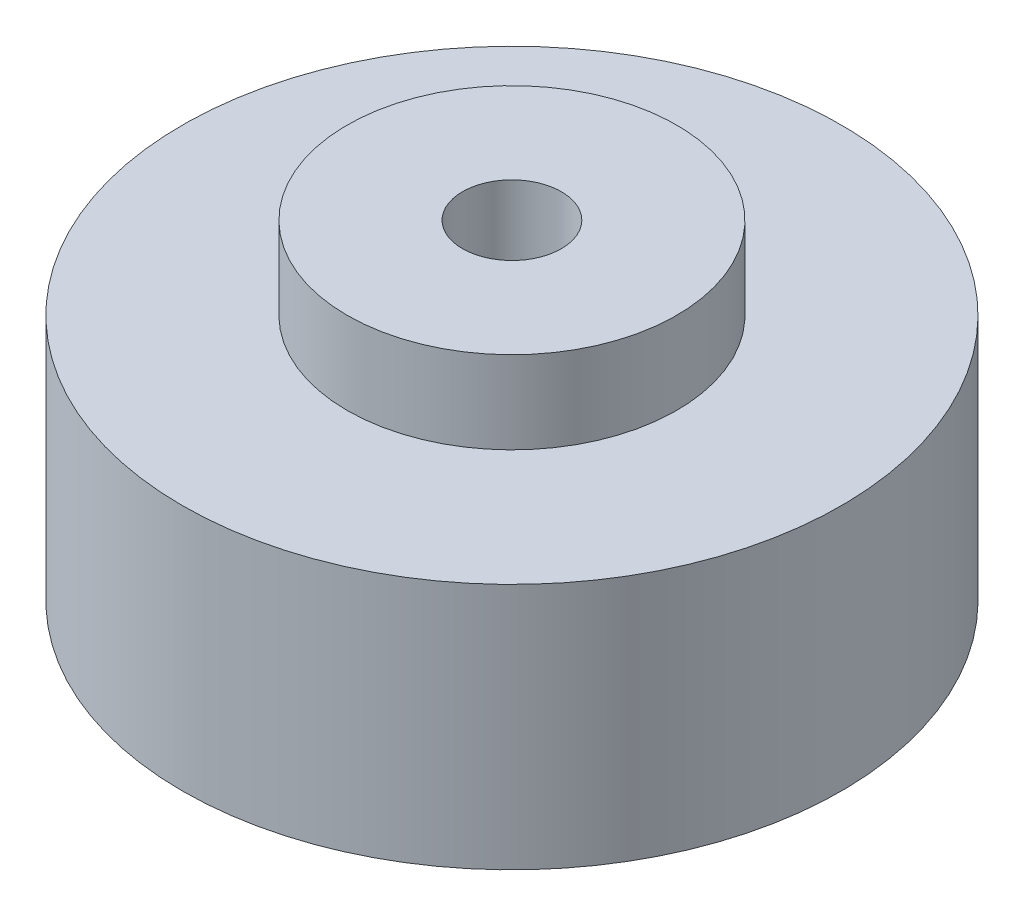
ISO-10303-21;
HEADER;
FILE_DESCRIPTION(('STEP AP214'),'2;1');
FILE_NAME('part.step','',(''),(''),'','','');
FILE_SCHEMA(('AUTOMOTIVE_DESIGN { 1 0 10303 214 1 1 1 1 }'));
ENDSEC;
DATA;
#1=APPLICATION_CONTEXT('core data for automotive mechanical design processes');
#2=APPLICATION_PROTOCOL_DEFINITION('international standard','automotive_design',2000,#1);
#3=PRODUCT_CONTEXT('',#1,'mechanical');
#4=PRODUCT('Part','Part','',(#3));
#5=PRODUCT_RELATED_PRODUCT_CATEGORY('part','',(#4));
#6=PRODUCT_DEFINITION_FORMATION('','',#4);
#7=PRODUCT_DEFINITION_CONTEXT('part definition',#1,'design');
#8=PRODUCT_DEFINITION('design','',#6,#7);
#9=PRODUCT_DEFINITION_SHAPE('','',#8);
#10=(LENGTH_UNIT() NAMED_UNIT(*) SI_UNIT(.MILLI.,.METRE.));
#11=(NAMED_UNIT(*) PLANE_ANGLE_UNIT() SI_UNIT($,.RADIAN.));
#12=(NAMED_UNIT(*) SI_UNIT($,.STERADIAN.) SOLID_ANGLE_UNIT());
#13=UNCERTAINTY_MEASURE_WITH_UNIT(LENGTH_MEASURE(1.E-05),#10,'distance_accuracy_value','');
#14=(GEOMETRIC_REPRESENTATION_CONTEXT(3) GLOBAL_UNCERTAINTY_ASSIGNED_CONTEXT((#13)) GLOBAL_UNIT_ASSIGNED_CONTEXT((#10,
#11,#12)) REPRESENTATION_CONTEXT('',''));
#15=CARTESIAN_POINT('',(0.,0.,0.));
#16=DIRECTION('',(0.,0.,1.));
#17=DIRECTION('',(1.,0.,0.));
#18=AXIS2_PLACEMENT_3D('',#15,#16,#17);
#19=CARTESIAN_POINT('',(0.,0.,0.));
#20=DIRECTION('',(0.,1.,0.));
#21=DIRECTION('',(0.,0.,1.));
#22=AXIS2_PLACEMENT_3D('',#19,#20,#21);
#23=PLANE('',#22);
#24=CARTESIAN_POINT('',(0.,0.,0.));
#25=DIRECTION('',(0.,1.,0.));
#26=DIRECTION('',(0.,0.,1.));
#27=AXIS2_PLACEMENT_3D('',#24,#25,#26);
#28=CIRCLE('',#27,20.);
#29=CARTESIAN_POINT('',(0.,0.,20.));
#30=VERTEX_POINT('',#29);
#31=EDGE_CURVE('E33',#30,#30,#28,.T.);
#32=ORIENTED_EDGE('',*,*,#31,.T.);
#33=EDGE_LOOP('',(#32));
#34=FACE_BOUND('',#33,.T.);
#35=CARTESIAN_POINT('',(0.,0.,0.));
#36=DIRECTION('',(0.,1.,0.));
#37=DIRECTION('',(0.,0.,1.));
#38=AXIS2_PLACEMENT_3D('',#35,#36,#37);
#39=CIRCLE('',#38,10.);
#40=CARTESIAN_POINT('',(0.,0.,10.));
#41=VERTEX_POINT('',#40);
#42=EDGE_CURVE('E42',#41,#41,#39,.T.);
#43=ORIENTED_EDGE('',*,*,#42,.F.);
#44=EDGE_LOOP('',(#43));
#45=FACE_BOUND('',#44,.T.);
#46=ADVANCED_FACE('F29',(#34,#45),#23,.T.);
#47=CARTESIAN_POINT('',(0.,-15.,0.));
#48=DIRECTION('',(0.,1.,0.));
#49=DIRECTION('',(0.,0.,1.));
#50=AXIS2_PLACEMENT_3D('',#47,#48,#49);
#51=CYLINDRICAL_SURFACE('',#50,20.);
#52=CARTESIAN_POINT('',(0.,-15.,0.));
#53=DIRECTION('',(0.,1.,0.));
#54=DIRECTION('',(0.,0.,1.));
#55=AXIS2_PLACEMENT_3D('',#52,#53,#54);
#56=CIRCLE('',#55,20.);
#57=CARTESIAN_POINT('',(0.,-15.,20.));
#58=VERTEX_POINT('',#57);
#59=EDGE_CURVE('E10',#58,#58,#56,.T.);
#60=ORIENTED_EDGE('',*,*,#59,.T.);
#61=EDGE_LOOP('',(#60));
#62=FACE_BOUND('',#61,.T.);
#63=ORIENTED_EDGE('',*,*,#31,.F.);
#64=EDGE_LOOP('',(#63));
#65=FACE_BOUND('',#64,.T.);
#66=ADVANCED_FACE('F31',(#62,#65),#51,.T.);
#67=CARTESIAN_POINT('',(0.,-15.,0.));
#68=DIRECTION('',(0.,1.,0.));
#69=DIRECTION('',(0.,0.,1.));
#70=AXIS2_PLACEMENT_3D('',#67,#68,#69);
#71=PLANE('',#70);
#72=CARTESIAN_POINT('',(0.,-15.,0.));
#73=DIRECTION('',(0.,1.,0.));
#74=DIRECTION('',(0.,0.,1.));
#75=AXIS2_PLACEMENT_3D('',#72,#73,#74);
#76=CIRCLE('',#75,3.);
#77=CARTESIAN_POINT('',(0.,-15.,3.));
#78=VERTEX_POINT('',#77);
#79=EDGE_CURVE('E45',#78,#78,#76,.T.);
#80=ORIENTED_EDGE('',*,*,#79,.T.);
#81=EDGE_LOOP('',(#80));
#82=FACE_BOUND('',#81,.T.);
#83=ORIENTED_EDGE('',*,*,#59,.F.);
#84=EDGE_LOOP('',(#83));
#85=FACE_BOUND('',#84,.T.);
#86=ADVANCED_FACE('F54',(#82,#85),#71,.F.);
#87=CARTESIAN_POINT('',(0.,5.,0.));
#88=DIRECTION('',(0.,-1.,0.));
#89=DIRECTION('',(0.,0.,-1.));
#90=AXIS2_PLACEMENT_3D('',#87,#88,#89);
#91=CYLINDRICAL_SURFACE('',#90,10.);
#92=CARTESIAN_POINT('',(0.,5.,0.));
#93=DIRECTION('',(0.,1.,0.));
#94=DIRECTION('',(0.,0.,1.));
#95=AXIS2_PLACEMENT_3D('',#92,#93,#94);
#96=CIRCLE('',#95,10.);
#97=CARTESIAN_POINT('',(0.,5.,10.));
#98=VERTEX_POINT('',#97);
#99=EDGE_CURVE('E40',#98,#98,#96,.T.);
#100=ORIENTED_EDGE('',*,*,#99,.F.);
#101=EDGE_LOOP('',(#100));
#102=FACE_BOUND('',#101,.T.);
#103=ORIENTED_EDGE('',*,*,#42,.T.);
#104=EDGE_LOOP('',(#103));
#105=FACE_BOUND('',#104,.T.);
#106=ADVANCED_FACE('F66',(#102,#105),#91,.T.);
#107=CARTESIAN_POINT('',(0.,5.,0.));
#108=DIRECTION('',(0.,1.,0.));
#109=DIRECTION('',(0.,0.,1.));
#110=AXIS2_PLACEMENT_3D('',#107,#108,#109);
#111=PLANE('',#110);
#112=CARTESIAN_POINT('',(0.,5.,0.));
#113=DIRECTION('',(0.,1.,0.));
#114=DIRECTION('',(0.,0.,1.));
#115=AXIS2_PLACEMENT_3D('',#112,#113,#114);
#116=CIRCLE('',#115,3.);
#117=CARTESIAN_POINT('',(0.,5.,3.));
#118=VERTEX_POINT('',#117);
#119=EDGE_CURVE('E48',#118,#118,#116,.T.);
#120=ORIENTED_EDGE('',*,*,#119,.F.);
#121=EDGE_LOOP('',(#120));
#122=FACE_BOUND('',#121,.T.);
#123=ORIENTED_EDGE('',*,*,#99,.T.);
#124=EDGE_LOOP('',(#123));
#125=FACE_BOUND('',#124,.T.);
#126=ADVANCED_FACE('F60',(#122,#125),#111,.T.);
#127=CARTESIAN_POINT('',(0.,-15.,0.));
#128=DIRECTION('',(0.,1.,0.));
#129=DIRECTION('',(0.,0.,1.));
#130=AXIS2_PLACEMENT_3D('',#127,#128,#129);
#131=CYLINDRICAL_SURFACE('',#130,3.);
#132=ORIENTED_EDGE('',*,*,#79,.F.);
#133=EDGE_LOOP('',(#132));
#134=FACE_BOUND('',#133,.T.);
#135=ORIENTED_EDGE('',*,*,#119,.T.);
#136=EDGE_LOOP('',(#135));
#137=FACE_BOUND('',#136,.T.);
#138=ADVANCED_FACE('F57',(#134,#137),#131,.F.);
#139=CLOSED_SHELL('',(#46,#66,#86,#106,#126,#138));
#140=MANIFOLD_SOLID_BREP('B2',#139);
#141=ADVANCED_BREP_SHAPE_REPRESENTATION('',(#18,#140),#14);
#142=SHAPE_DEFINITION_REPRESENTATION(#9,#141);
ENDSEC;
END-ISO-10303-21;
